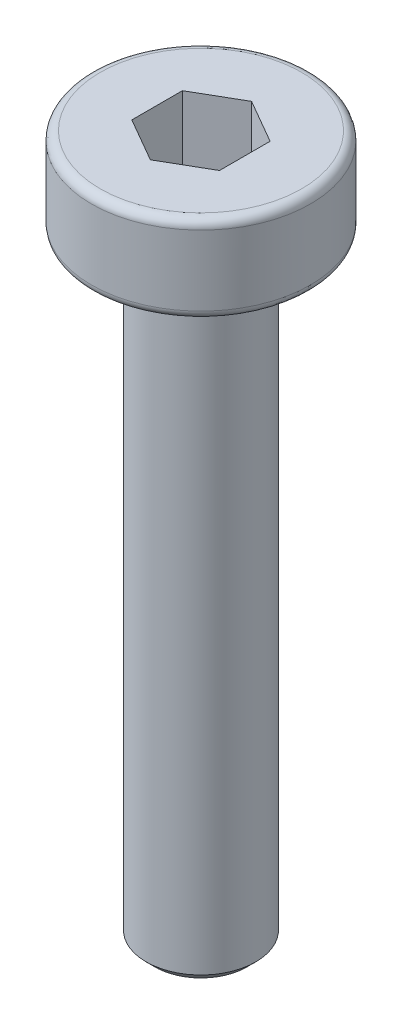
ISO-10303-21;
HEADER;
FILE_DESCRIPTION(('STEP AP214'),'2;1');
FILE_NAME('part.step','',(''),(''),'','','');
FILE_SCHEMA(('AUTOMOTIVE_DESIGN { 1 0 10303 214 1 1 1 1 }'));
ENDSEC;
DATA;
#1=APPLICATION_CONTEXT('core data for automotive mechanical design processes');
#2=APPLICATION_PROTOCOL_DEFINITION('international standard','automotive_design',2000,#1);
#3=PRODUCT_CONTEXT('',#1,'mechanical');
#4=PRODUCT('Part','Part','',(#3));
#5=PRODUCT_RELATED_PRODUCT_CATEGORY('part','',(#4));
#6=PRODUCT_DEFINITION_FORMATION('','',#4);
#7=PRODUCT_DEFINITION_CONTEXT('part definition',#1,'design');
#8=PRODUCT_DEFINITION('design','',#6,#7);
#9=PRODUCT_DEFINITION_SHAPE('','',#8);
#10=(LENGTH_UNIT() NAMED_UNIT(*) SI_UNIT(.MILLI.,.METRE.));
#11=(NAMED_UNIT(*) PLANE_ANGLE_UNIT() SI_UNIT($,.RADIAN.));
#12=(NAMED_UNIT(*) SI_UNIT($,.STERADIAN.) SOLID_ANGLE_UNIT());
#13=UNCERTAINTY_MEASURE_WITH_UNIT(LENGTH_MEASURE(1.E-05),#10,'distance_accuracy_value','');
#14=(GEOMETRIC_REPRESENTATION_CONTEXT(3) GLOBAL_UNCERTAINTY_ASSIGNED_CONTEXT((#13)) GLOBAL_UNIT_ASSIGNED_CONTEXT((#10,
#11,#12)) REPRESENTATION_CONTEXT('',''));
#15=CARTESIAN_POINT('',(0.,0.,0.));
#16=DIRECTION('',(0.,0.,1.));
#17=DIRECTION('',(1.,0.,0.));
#18=AXIS2_PLACEMENT_3D('',#15,#16,#17);
#19=CARTESIAN_POINT('',(0.,2.,0.));
#20=DIRECTION('',(0.,1.,0.));
#21=DIRECTION('',(0.,0.,1.));
#22=AXIS2_PLACEMENT_3D('',#19,#20,#21);
#23=PLANE('',#22);
#24=CARTESIAN_POINT('',(0.,2.,0.));
#25=DIRECTION('',(0.,1.,0.));
#26=DIRECTION('',(0.,0.,1.));
#27=AXIS2_PLACEMENT_3D('',#24,#25,#26);
#28=CIRCLE('',#27,2.3);
#29=CARTESIAN_POINT('',(0.,2.,2.3));
#30=VERTEX_POINT('',#29);
#31=EDGE_CURVE('E136',#30,#30,#28,.T.);
#32=ORIENTED_EDGE('',*,*,#31,.T.);
#33=EDGE_LOOP('',(#32));
#34=FACE_BOUND('',#33,.T.);
#35=DIRECTION('',(-0.866025403784439,0.,0.5));
#36=VECTOR('',#35,1.);
#37=CARTESIAN_POINT('',(0.,2.,-1.15470053837925));
#38=LINE('',#37,#36);
#39=CARTESIAN_POINT('',(0.,2.,-1.15470053837925));
#40=VERTEX_POINT('',#39);
#41=CARTESIAN_POINT('',(-1.,2.,-0.577350269189626));
#42=VERTEX_POINT('',#41);
#43=EDGE_CURVE('E32',#40,#42,#38,.T.);
#44=ORIENTED_EDGE('',*,*,#43,.F.);
#45=DIRECTION('',(-0.866025403784439,0.,-0.5));
#46=VECTOR('',#45,1.);
#47=CARTESIAN_POINT('',(1.,2.,-0.577350269189626));
#48=LINE('',#47,#46);
#49=CARTESIAN_POINT('',(1.,2.,-0.577350269189626));
#50=VERTEX_POINT('',#49);
#51=EDGE_CURVE('E115',#50,#40,#48,.T.);
#52=ORIENTED_EDGE('',*,*,#51,.F.);
#53=DIRECTION('',(0.,0.,-1.));
#54=VECTOR('',#53,1.);
#55=CARTESIAN_POINT('',(1.,2.,0.577350269189626));
#56=LINE('',#55,#54);
#57=CARTESIAN_POINT('',(1.,2.,0.577350269189626));
#58=VERTEX_POINT('',#57);
#59=EDGE_CURVE('E113',#58,#50,#56,.T.);
#60=ORIENTED_EDGE('',*,*,#59,.F.);
#61=DIRECTION('',(0.866025403784439,0.,-0.5));
#62=VECTOR('',#61,1.);
#63=CARTESIAN_POINT('',(0.,2.,1.15470053837925));
#64=LINE('',#63,#62);
#65=CARTESIAN_POINT('',(0.,2.,1.15470053837925));
#66=VERTEX_POINT('',#65);
#67=EDGE_CURVE('E80',#66,#58,#64,.T.);
#68=ORIENTED_EDGE('',*,*,#67,.F.);
#69=DIRECTION('',(0.866025403784439,0.,0.5));
#70=VECTOR('',#69,1.);
#71=CARTESIAN_POINT('',(-1.,2.,0.577350269189626));
#72=LINE('',#71,#70);
#73=CARTESIAN_POINT('',(-1.,2.,0.577350269189626));
#74=VERTEX_POINT('',#73);
#75=EDGE_CURVE('E109',#74,#66,#72,.T.);
#76=ORIENTED_EDGE('',*,*,#75,.F.);
#77=DIRECTION('',(0.,0.,1.));
#78=VECTOR('',#77,1.);
#79=CARTESIAN_POINT('',(-1.,2.,-0.577350269189626));
#80=LINE('',#79,#78);
#81=EDGE_CURVE('E106',#42,#74,#80,.T.);
#82=ORIENTED_EDGE('',*,*,#81,.F.);
#83=EDGE_LOOP('',(#44,#52,#60,#68,#76,#82));
#84=FACE_BOUND('',#83,.T.);
#85=ADVANCED_FACE('F17',(#34,#84),#23,.T.);
#86=CARTESIAN_POINT('',(0.,60.1595545799248,0.));
#87=DIRECTION('',(0.,1.,0.));
#88=DIRECTION('',(0.,0.,1.));
#89=AXIS2_PLACEMENT_3D('',#86,#87,#88);
#90=CYLINDRICAL_SURFACE('',#89,2.5);
#91=CARTESIAN_POINT('',(0.,0.2,0.));
#92=DIRECTION('',(0.,-1.,0.));
#93=DIRECTION('',(0.,0.,-1.));
#94=AXIS2_PLACEMENT_3D('',#91,#92,#93);
#95=CIRCLE('',#94,2.5);
#96=CARTESIAN_POINT('',(0.,0.2,-2.5));
#97=VERTEX_POINT('',#96);
#98=EDGE_CURVE('E130',#97,#97,#95,.F.);
#99=ORIENTED_EDGE('',*,*,#98,.T.);
#100=EDGE_LOOP('',(#99));
#101=FACE_BOUND('',#100,.T.);
#102=CARTESIAN_POINT('',(0.,1.8,0.));
#103=DIRECTION('',(0.,1.,0.));
#104=DIRECTION('',(0.,0.,1.));
#105=AXIS2_PLACEMENT_3D('',#102,#103,#104);
#106=CIRCLE('',#105,2.5);
#107=CARTESIAN_POINT('',(0.,1.8,2.5));
#108=VERTEX_POINT('',#107);
#109=EDGE_CURVE('E127',#108,#108,#106,.F.);
#110=ORIENTED_EDGE('',*,*,#109,.T.);
#111=EDGE_LOOP('',(#110));
#112=FACE_BOUND('',#111,.T.);
#113=ADVANCED_FACE('F156',(#101,#112),#90,.T.);
#114=CARTESIAN_POINT('',(-1.25,0.,0.));
#115=DIRECTION('',(0.,-1.,0.));
#116=DIRECTION('',(0.,0.,-1.));
#117=AXIS2_PLACEMENT_3D('',#114,#115,#116);
#118=PLANE('',#117);
#119=CARTESIAN_POINT('',(0.,0.,0.));
#120=DIRECTION('',(0.,-1.,0.));
#121=DIRECTION('',(0.,0.,-1.));
#122=AXIS2_PLACEMENT_3D('',#119,#120,#121);
#123=CIRCLE('',#122,2.3);
#124=CARTESIAN_POINT('',(0.,0.,-2.3));
#125=VERTEX_POINT('',#124);
#126=EDGE_CURVE('E133',#125,#125,#123,.T.);
#127=ORIENTED_EDGE('',*,*,#126,.T.);
#128=EDGE_LOOP('',(#127));
#129=FACE_BOUND('',#128,.T.);
#130=CARTESIAN_POINT('',(0.,0.,0.));
#131=DIRECTION('',(0.,1.,0.));
#132=DIRECTION('',(0.,0.,1.));
#133=AXIS2_PLACEMENT_3D('',#130,#131,#132);
#134=CIRCLE('',#133,1.25);
#135=CARTESIAN_POINT('',(0.,0.,1.25));
#136=VERTEX_POINT('',#135);
#137=EDGE_CURVE('E119',#136,#136,#134,.T.);
#138=ORIENTED_EDGE('',*,*,#137,.T.);
#139=EDGE_LOOP('',(#138));
#140=FACE_BOUND('',#139,.T.);
#141=ADVANCED_FACE('F163',(#129,#140),#118,.T.);
#142=CARTESIAN_POINT('',(0.,60.1595545799248,0.));
#143=DIRECTION('',(0.,1.,0.));
#144=DIRECTION('',(0.,0.,1.));
#145=AXIS2_PLACEMENT_3D('',#142,#143,#144);
#146=CYLINDRICAL_SURFACE('',#145,1.25);
#147=CARTESIAN_POINT('',(0.,-13.8,0.));
#148=DIRECTION('',(0.,-1.,0.));
#149=DIRECTION('',(0.,0.,-1.));
#150=AXIS2_PLACEMENT_3D('',#147,#148,#149);
#151=CIRCLE('',#150,1.25);
#152=CARTESIAN_POINT('',(0.,-13.8,-1.25));
#153=VERTEX_POINT('',#152);
#154=EDGE_CURVE('E25',#153,#153,#151,.F.);
#155=ORIENTED_EDGE('',*,*,#154,.T.);
#156=EDGE_LOOP('',(#155));
#157=FACE_BOUND('',#156,.T.);
#158=ORIENTED_EDGE('',*,*,#137,.F.);
#159=EDGE_LOOP('',(#158));
#160=FACE_BOUND('',#159,.T.);
#161=ADVANCED_FACE('F141',(#157,#160),#146,.T.);
#162=CARTESIAN_POINT('',(0.,-14.,0.));
#163=DIRECTION('',(0.,-1.,0.));
#164=DIRECTION('',(0.,0.,-1.));
#165=AXIS2_PLACEMENT_3D('',#162,#163,#164);
#166=PLANE('',#165);
#167=CARTESIAN_POINT('',(0.,-14.,0.));
#168=DIRECTION('',(0.,-1.,0.));
#169=DIRECTION('',(0.,0.,-1.));
#170=AXIS2_PLACEMENT_3D('',#167,#168,#169);
#171=CIRCLE('',#170,1.04999999999998);
#172=CARTESIAN_POINT('',(0.,-14.,-1.04999999999998));
#173=VERTEX_POINT('',#172);
#174=EDGE_CURVE('E11',#173,#173,#171,.T.);
#175=ORIENTED_EDGE('',*,*,#174,.T.);
#176=EDGE_LOOP('',(#175));
#177=FACE_BOUND('',#176,.T.);
#178=ADVANCED_FACE('F189',(#177),#166,.T.);
#179=CARTESIAN_POINT('',(0.,0.5,-1.15470053837925));
#180=DIRECTION('',(-0.5,0.,-0.866025403784439));
#181=DIRECTION('',(-0.866025403784439,0.,0.5));
#182=AXIS2_PLACEMENT_3D('',#179,#180,#181);
#183=PLANE('',#182);
#184=ORIENTED_EDGE('',*,*,#43,.T.);
#185=DIRECTION('',(0.,1.,0.));
#186=VECTOR('',#185,1.);
#187=CARTESIAN_POINT('',(-1.,0.5,-0.577350269189626));
#188=LINE('',#187,#186);
#189=CARTESIAN_POINT('',(-1.,0.5,-0.577350269189626));
#190=VERTEX_POINT('',#189);
#191=EDGE_CURVE('E62',#190,#42,#188,.T.);
#192=ORIENTED_EDGE('',*,*,#191,.F.);
#193=DIRECTION('',(-0.866025403784439,0.,0.5));
#194=VECTOR('',#193,1.);
#195=CARTESIAN_POINT('',(0.,0.5,-1.15470053837925));
#196=LINE('',#195,#194);
#197=CARTESIAN_POINT('',(0.,0.5,-1.15470053837925));
#198=VERTEX_POINT('',#197);
#199=EDGE_CURVE('E117',#198,#190,#196,.T.);
#200=ORIENTED_EDGE('',*,*,#199,.F.);
#201=DIRECTION('',(0.,1.,0.));
#202=VECTOR('',#201,1.);
#203=CARTESIAN_POINT('',(0.,0.5,-1.15470053837925));
#204=LINE('',#203,#202);
#205=EDGE_CURVE('E40',#198,#40,#204,.T.);
#206=ORIENTED_EDGE('',*,*,#205,.T.);
#207=EDGE_LOOP('',(#184,#192,#200,#206));
#208=FACE_BOUND('',#207,.T.);
#209=ADVANCED_FACE('F195',(#208),#183,.F.);
#210=CARTESIAN_POINT('',(1.,0.5,-0.577350269189626));
#211=DIRECTION('',(0.5,0.,-0.866025403784439));
#212=DIRECTION('',(-0.866025403784439,0.,-0.5));
#213=AXIS2_PLACEMENT_3D('',#210,#211,#212);
#214=PLANE('',#213);
#215=ORIENTED_EDGE('',*,*,#51,.T.);
#216=ORIENTED_EDGE('',*,*,#205,.F.);
#217=DIRECTION('',(-0.866025403784439,0.,-0.5));
#218=VECTOR('',#217,1.);
#219=CARTESIAN_POINT('',(1.,0.5,-0.577350269189626));
#220=LINE('',#219,#218);
#221=CARTESIAN_POINT('',(1.,0.5,-0.577350269189626));
#222=VERTEX_POINT('',#221);
#223=EDGE_CURVE('E92',#222,#198,#220,.T.);
#224=ORIENTED_EDGE('',*,*,#223,.F.);
#225=DIRECTION('',(0.,1.,0.));
#226=VECTOR('',#225,1.);
#227=CARTESIAN_POINT('',(1.,0.5,-0.577350269189626));
#228=LINE('',#227,#226);
#229=EDGE_CURVE('E84',#222,#50,#228,.T.);
#230=ORIENTED_EDGE('',*,*,#229,.T.);
#231=EDGE_LOOP('',(#215,#216,#224,#230));
#232=FACE_BOUND('',#231,.T.);
#233=ADVANCED_FACE('F201',(#232),#214,.F.);
#234=CARTESIAN_POINT('',(1.,0.5,0.577350269189626));
#235=DIRECTION('',(1.,0.,0.));
#236=DIRECTION('',(0.,0.,-1.));
#237=AXIS2_PLACEMENT_3D('',#234,#235,#236);
#238=PLANE('',#237);
#239=ORIENTED_EDGE('',*,*,#59,.T.);
#240=ORIENTED_EDGE('',*,*,#229,.F.);
#241=DIRECTION('',(0.,0.,-1.));
#242=VECTOR('',#241,1.);
#243=CARTESIAN_POINT('',(1.,0.5,0.577350269189626));
#244=LINE('',#243,#242);
#245=CARTESIAN_POINT('',(1.,0.5,0.577350269189626));
#246=VERTEX_POINT('',#245);
#247=EDGE_CURVE('E88',#246,#222,#244,.T.);
#248=ORIENTED_EDGE('',*,*,#247,.F.);
#249=DIRECTION('',(0.,1.,0.));
#250=VECTOR('',#249,1.);
#251=CARTESIAN_POINT('',(1.,0.5,0.577350269189626));
#252=LINE('',#251,#250);
#253=EDGE_CURVE('E73',#246,#58,#252,.T.);
#254=ORIENTED_EDGE('',*,*,#253,.T.);
#255=EDGE_LOOP('',(#239,#240,#248,#254));
#256=FACE_BOUND('',#255,.T.);
#257=ADVANCED_FACE('F89',(#256),#238,.F.);
#258=CARTESIAN_POINT('',(0.,0.5,1.15470053837925));
#259=DIRECTION('',(0.5,0.,0.866025403784438));
#260=DIRECTION('',(0.866025403784439,0.,-0.5));
#261=AXIS2_PLACEMENT_3D('',#258,#259,#260);
#262=PLANE('',#261);
#263=ORIENTED_EDGE('',*,*,#67,.T.);
#264=ORIENTED_EDGE('',*,*,#253,.F.);
#265=DIRECTION('',(0.866025403784439,0.,-0.5));
#266=VECTOR('',#265,1.);
#267=CARTESIAN_POINT('',(0.,0.5,1.15470053837925));
#268=LINE('',#267,#266);
#269=CARTESIAN_POINT('',(0.,0.5,1.15470053837925));
#270=VERTEX_POINT('',#269);
#271=EDGE_CURVE('E77',#270,#246,#268,.T.);
#272=ORIENTED_EDGE('',*,*,#271,.F.);
#273=DIRECTION('',(0.,1.,0.));
#274=VECTOR('',#273,1.);
#275=CARTESIAN_POINT('',(0.,0.5,1.15470053837925));
#276=LINE('',#275,#274);
#277=EDGE_CURVE('E85',#270,#66,#276,.T.);
#278=ORIENTED_EDGE('',*,*,#277,.T.);
#279=EDGE_LOOP('',(#263,#264,#272,#278));
#280=FACE_BOUND('',#279,.T.);
#281=ADVANCED_FACE('F75',(#280),#262,.F.);
#282=CARTESIAN_POINT('',(-1.,0.5,0.577350269189626));
#283=DIRECTION('',(-0.5,0.,0.866025403784439));
#284=DIRECTION('',(0.866025403784439,0.,0.5));
#285=AXIS2_PLACEMENT_3D('',#282,#283,#284);
#286=PLANE('',#285);
#287=ORIENTED_EDGE('',*,*,#75,.T.);
#288=ORIENTED_EDGE('',*,*,#277,.F.);
#289=DIRECTION('',(0.866025403784439,0.,0.5));
#290=VECTOR('',#289,1.);
#291=CARTESIAN_POINT('',(-1.,0.5,0.577350269189626));
#292=LINE('',#291,#290);
#293=CARTESIAN_POINT('',(-1.,0.5,0.577350269189626));
#294=VERTEX_POINT('',#293);
#295=EDGE_CURVE('E98',#294,#270,#292,.T.);
#296=ORIENTED_EDGE('',*,*,#295,.F.);
#297=DIRECTION('',(0.,1.,0.));
#298=VECTOR('',#297,1.);
#299=CARTESIAN_POINT('',(-1.,0.5,0.577350269189626));
#300=LINE('',#299,#298);
#301=EDGE_CURVE('E122',#294,#74,#300,.T.);
#302=ORIENTED_EDGE('',*,*,#301,.T.);
#303=EDGE_LOOP('',(#287,#288,#296,#302));
#304=FACE_BOUND('',#303,.T.);
#305=ADVANCED_FACE('F204',(#304),#286,.F.);
#306=CARTESIAN_POINT('',(-1.,0.5,-0.577350269189626));
#307=DIRECTION('',(-1.,0.,0.));
#308=DIRECTION('',(0.,0.,1.));
#309=AXIS2_PLACEMENT_3D('',#306,#307,#308);
#310=PLANE('',#309);
#311=ORIENTED_EDGE('',*,*,#81,.T.);
#312=ORIENTED_EDGE('',*,*,#301,.F.);
#313=DIRECTION('',(0.,0.,1.));
#314=VECTOR('',#313,1.);
#315=CARTESIAN_POINT('',(-1.,0.5,-0.577350269189626));
#316=LINE('',#315,#314);
#317=EDGE_CURVE('E100',#190,#294,#316,.T.);
#318=ORIENTED_EDGE('',*,*,#317,.F.);
#319=ORIENTED_EDGE('',*,*,#191,.T.);
#320=EDGE_LOOP('',(#311,#312,#318,#319));
#321=FACE_BOUND('',#320,.T.);
#322=ADVANCED_FACE('F175',(#321),#310,.F.);
#323=CARTESIAN_POINT('',(0.,0.5,0.));
#324=DIRECTION('',(0.,1.,0.));
#325=DIRECTION('',(0.,0.,1.));
#326=AXIS2_PLACEMENT_3D('',#323,#324,#325);
#327=PLANE('',#326);
#328=ORIENTED_EDGE('',*,*,#199,.T.);
#329=ORIENTED_EDGE('',*,*,#317,.T.);
#330=ORIENTED_EDGE('',*,*,#295,.T.);
#331=ORIENTED_EDGE('',*,*,#271,.T.);
#332=ORIENTED_EDGE('',*,*,#247,.T.);
#333=ORIENTED_EDGE('',*,*,#223,.T.);
#334=EDGE_LOOP('',(#328,#329,#330,#331,#332,#333));
#335=FACE_BOUND('',#334,.T.);
#336=ADVANCED_FACE('F95',(#335),#327,.T.);
#337=CARTESIAN_POINT('',(0.,0.2,0.));
#338=DIRECTION('',(0.,-1.,0.));
#339=DIRECTION('',(0.,0.,-1.));
#340=AXIS2_PLACEMENT_3D('',#337,#338,#339);
#341=TOROIDAL_SURFACE('',#340,2.3,0.2);
#342=ORIENTED_EDGE('',*,*,#126,.F.);
#343=EDGE_LOOP('',(#342));
#344=FACE_BOUND('',#343,.T.);
#345=ORIENTED_EDGE('',*,*,#98,.F.);
#346=EDGE_LOOP('',(#345));
#347=FACE_BOUND('',#346,.T.);
#348=ADVANCED_FACE('F152',(#344,#347),#341,.T.);
#349=CARTESIAN_POINT('',(0.,1.8,0.));
#350=DIRECTION('',(0.,1.,0.));
#351=DIRECTION('',(0.,0.,1.));
#352=AXIS2_PLACEMENT_3D('',#349,#350,#351);
#353=TOROIDAL_SURFACE('',#352,2.3,0.2);
#354=ORIENTED_EDGE('',*,*,#109,.F.);
#355=EDGE_LOOP('',(#354));
#356=FACE_BOUND('',#355,.T.);
#357=ORIENTED_EDGE('',*,*,#31,.F.);
#358=EDGE_LOOP('',(#357));
#359=FACE_BOUND('',#358,.T.);
#360=ADVANCED_FACE('F145',(#356,#359),#353,.T.);
#361=CARTESIAN_POINT('',(0.,-13.8,0.));
#362=DIRECTION('',(0.,1.,0.));
#363=DIRECTION('',(0.,0.,1.));
#364=AXIS2_PLACEMENT_3D('',#361,#362,#363);
#365=CONICAL_SURFACE('',#364,1.25,0.785398163397449);
#366=ORIENTED_EDGE('',*,*,#174,.F.);
#367=EDGE_LOOP('',(#366));
#368=FACE_BOUND('',#367,.T.);
#369=ORIENTED_EDGE('',*,*,#154,.F.);
#370=EDGE_LOOP('',(#369));
#371=FACE_BOUND('',#370,.T.);
#372=ADVANCED_FACE('F19',(#368,#371),#365,.T.);
#373=CLOSED_SHELL('',(#85,#113,#141,#161,#178,#209,#233,#257,#281,#305,#322,#336,#348,#360,#372));
#374=MANIFOLD_SOLID_BREP('B1',#373);
#375=ADVANCED_BREP_SHAPE_REPRESENTATION('',(#18,#374),#14);
#376=SHAPE_DEFINITION_REPRESENTATION(#9,#375);
ENDSEC;
END-ISO-10303-21;
